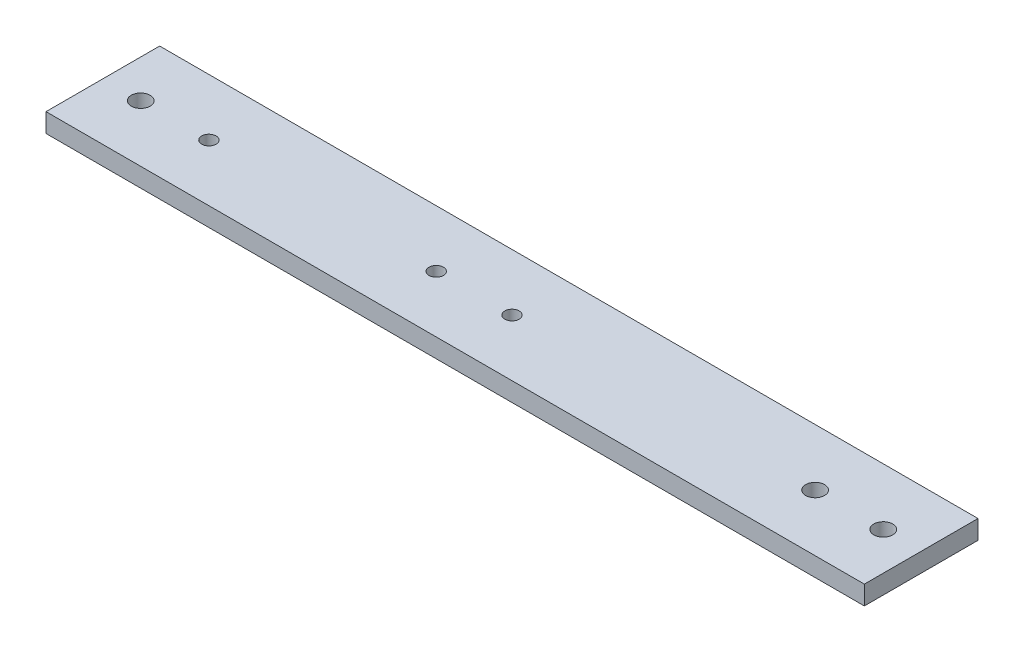
ISO-10303-21;
HEADER;
FILE_DESCRIPTION(('STEP AP214'),'2;1');
FILE_NAME('part.step','',(''),(''),'','','');
FILE_SCHEMA(('AUTOMOTIVE_DESIGN { 1 0 10303 214 1 1 1 1 }'));
ENDSEC;
DATA;
#1=APPLICATION_CONTEXT('core data for automotive mechanical design processes');
#2=APPLICATION_PROTOCOL_DEFINITION('international standard','automotive_design',2000,#1);
#3=PRODUCT_CONTEXT('',#1,'mechanical');
#4=PRODUCT('Part','Part','',(#3));
#5=PRODUCT_RELATED_PRODUCT_CATEGORY('part','',(#4));
#6=PRODUCT_DEFINITION_FORMATION('','',#4);
#7=PRODUCT_DEFINITION_CONTEXT('part definition',#1,'design');
#8=PRODUCT_DEFINITION('design','',#6,#7);
#9=PRODUCT_DEFINITION_SHAPE('','',#8);
#10=(LENGTH_UNIT() NAMED_UNIT(*) SI_UNIT(.MILLI.,.METRE.));
#11=(NAMED_UNIT(*) PLANE_ANGLE_UNIT() SI_UNIT($,.RADIAN.));
#12=(NAMED_UNIT(*) SI_UNIT($,.STERADIAN.) SOLID_ANGLE_UNIT());
#13=UNCERTAINTY_MEASURE_WITH_UNIT(LENGTH_MEASURE(1.E-05),#10,'distance_accuracy_value','');
#14=(GEOMETRIC_REPRESENTATION_CONTEXT(3) GLOBAL_UNCERTAINTY_ASSIGNED_CONTEXT((#13)) GLOBAL_UNIT_ASSIGNED_CONTEXT((#10,
#11,#12)) REPRESENTATION_CONTEXT('',''));
#15=CARTESIAN_POINT('',(0.,0.,0.));
#16=DIRECTION('',(0.,0.,1.));
#17=DIRECTION('',(1.,0.,0.));
#18=AXIS2_PLACEMENT_3D('',#15,#16,#17);
#19=CARTESIAN_POINT('',(0.,6.35,0.));
#20=DIRECTION('',(0.,-1.,0.));
#21=DIRECTION('',(0.,0.,-1.));
#22=AXIS2_PLACEMENT_3D('',#19,#20,#21);
#23=PLANE('',#22);
#24=DIRECTION('',(0.,0.,-1.));
#25=VECTOR('',#24,1.);
#26=CARTESIAN_POINT('',(137.16,6.35,19.05));
#27=LINE('',#26,#25);
#28=CARTESIAN_POINT('',(137.16,6.35,19.05));
#29=VERTEX_POINT('',#28);
#30=CARTESIAN_POINT('',(137.16,6.35,-19.05));
#31=VERTEX_POINT('',#30);
#32=EDGE_CURVE('E84',#29,#31,#27,.T.);
#33=ORIENTED_EDGE('',*,*,#32,.T.);
#34=DIRECTION('',(-1.,0.,0.));
#35=VECTOR('',#34,1.);
#36=CARTESIAN_POINT('',(-137.16,6.35,-19.05));
#37=LINE('',#36,#35);
#38=CARTESIAN_POINT('',(-137.16,6.35,-19.05));
#39=VERTEX_POINT('',#38);
#40=EDGE_CURVE('E79',#31,#39,#37,.T.);
#41=ORIENTED_EDGE('',*,*,#40,.T.);
#42=DIRECTION('',(0.,0.,1.));
#43=VECTOR('',#42,1.);
#44=CARTESIAN_POINT('',(-137.16,6.35,19.05));
#45=LINE('',#44,#43);
#46=CARTESIAN_POINT('',(-137.16,6.35,19.05));
#47=VERTEX_POINT('',#46);
#48=EDGE_CURVE('E82',#39,#47,#45,.T.);
#49=ORIENTED_EDGE('',*,*,#48,.T.);
#50=DIRECTION('',(1.,0.,0.));
#51=VECTOR('',#50,1.);
#52=CARTESIAN_POINT('',(-137.16,6.35,19.05));
#53=LINE('',#52,#51);
#54=EDGE_CURVE('E49',#47,#29,#53,.T.);
#55=ORIENTED_EDGE('',*,*,#54,.T.);
#56=EDGE_LOOP('',(#33,#41,#49,#55));
#57=FACE_BOUND('',#56,.T.);
#58=CARTESIAN_POINT('',(-124.46,6.35,0.));
#59=DIRECTION('',(0.,1.,0.));
#60=DIRECTION('',(0.,0.,1.));
#61=AXIS2_PLACEMENT_3D('',#58,#59,#60);
#62=CIRCLE('',#61,3.175);
#63=CARTESIAN_POINT('',(-124.46,6.35,3.175));
#64=VERTEX_POINT('',#63);
#65=EDGE_CURVE('E99',#64,#64,#62,.T.);
#66=ORIENTED_EDGE('',*,*,#65,.F.);
#67=EDGE_LOOP('',(#66));
#68=FACE_BOUND('',#67,.T.);
#69=CARTESIAN_POINT('',(124.46,6.35,0.));
#70=DIRECTION('',(0.,1.,0.));
#71=DIRECTION('',(0.,0.,1.));
#72=AXIS2_PLACEMENT_3D('',#69,#70,#71);
#73=CIRCLE('',#72,3.17499999999998);
#74=CARTESIAN_POINT('',(124.46,6.35,3.17499999999998));
#75=VERTEX_POINT('',#74);
#76=EDGE_CURVE('E114',#75,#75,#73,.T.);
#77=ORIENTED_EDGE('',*,*,#76,.F.);
#78=EDGE_LOOP('',(#77));
#79=FACE_BOUND('',#78,.T.);
#80=CARTESIAN_POINT('',(-101.6,6.35,0.));
#81=DIRECTION('',(0.,1.,0.));
#82=DIRECTION('',(0.,0.,1.));
#83=AXIS2_PLACEMENT_3D('',#80,#81,#82);
#84=CIRCLE('',#83,2.413);
#85=CARTESIAN_POINT('',(-101.6,6.35,2.413));
#86=VERTEX_POINT('',#85);
#87=EDGE_CURVE('E120',#86,#86,#84,.T.);
#88=ORIENTED_EDGE('',*,*,#87,.F.);
#89=EDGE_LOOP('',(#88));
#90=FACE_BOUND('',#89,.T.);
#91=CARTESIAN_POINT('',(-25.4,6.35,0.));
#92=DIRECTION('',(0.,1.,0.));
#93=DIRECTION('',(0.,0.,1.));
#94=AXIS2_PLACEMENT_3D('',#91,#92,#93);
#95=CIRCLE('',#94,2.413);
#96=CARTESIAN_POINT('',(-25.4,6.35,2.413));
#97=VERTEX_POINT('',#96);
#98=EDGE_CURVE('E126',#97,#97,#95,.T.);
#99=ORIENTED_EDGE('',*,*,#98,.F.);
#100=EDGE_LOOP('',(#99));
#101=FACE_BOUND('',#100,.T.);
#102=CARTESIAN_POINT('',(0.,6.35,0.));
#103=DIRECTION('',(0.,1.,0.));
#104=DIRECTION('',(0.,0.,1.));
#105=AXIS2_PLACEMENT_3D('',#102,#103,#104);
#106=CIRCLE('',#105,2.413);
#107=CARTESIAN_POINT('',(0.,6.35,2.413));
#108=VERTEX_POINT('',#107);
#109=EDGE_CURVE('E132',#108,#108,#106,.T.);
#110=ORIENTED_EDGE('',*,*,#109,.F.);
#111=EDGE_LOOP('',(#110));
#112=FACE_BOUND('',#111,.T.);
#113=CARTESIAN_POINT('',(101.6,6.35,0.));
#114=DIRECTION('',(0.,1.,0.));
#115=DIRECTION('',(0.,0.,1.));
#116=AXIS2_PLACEMENT_3D('',#113,#114,#115);
#117=CIRCLE('',#116,3.175);
#118=CARTESIAN_POINT('',(101.6,6.35,3.175));
#119=VERTEX_POINT('',#118);
#120=EDGE_CURVE('E138',#119,#119,#117,.T.);
#121=ORIENTED_EDGE('',*,*,#120,.F.);
#122=EDGE_LOOP('',(#121));
#123=FACE_BOUND('',#122,.T.);
#124=ADVANCED_FACE('F32',(#57,#68,#79,#90,#101,#112,#123),#23,.F.);
#125=CARTESIAN_POINT('',(0.,0.,0.));
#126=DIRECTION('',(0.,-1.,0.));
#127=DIRECTION('',(0.,0.,-1.));
#128=AXIS2_PLACEMENT_3D('',#125,#126,#127);
#129=PLANE('',#128);
#130=CARTESIAN_POINT('',(0.,0.,0.));
#131=DIRECTION('',(0.,1.,0.));
#132=DIRECTION('',(0.,0.,1.));
#133=AXIS2_PLACEMENT_3D('',#130,#131,#132);
#134=CIRCLE('',#133,2.413);
#135=CARTESIAN_POINT('',(0.,0.,2.413));
#136=VERTEX_POINT('',#135);
#137=EDGE_CURVE('E135',#136,#136,#134,.T.);
#138=ORIENTED_EDGE('',*,*,#137,.T.);
#139=EDGE_LOOP('',(#138));
#140=FACE_BOUND('',#139,.T.);
#141=CARTESIAN_POINT('',(-101.6,0.,0.));
#142=DIRECTION('',(0.,1.,0.));
#143=DIRECTION('',(0.,0.,1.));
#144=AXIS2_PLACEMENT_3D('',#141,#142,#143);
#145=CIRCLE('',#144,2.413);
#146=CARTESIAN_POINT('',(-101.6,0.,2.413));
#147=VERTEX_POINT('',#146);
#148=EDGE_CURVE('E123',#147,#147,#145,.T.);
#149=ORIENTED_EDGE('',*,*,#148,.T.);
#150=EDGE_LOOP('',(#149));
#151=FACE_BOUND('',#150,.T.);
#152=CARTESIAN_POINT('',(-124.46,0.,0.));
#153=DIRECTION('',(0.,1.,0.));
#154=DIRECTION('',(0.,0.,1.));
#155=AXIS2_PLACEMENT_3D('',#152,#153,#154);
#156=CIRCLE('',#155,3.175);
#157=CARTESIAN_POINT('',(-124.46,0.,3.175));
#158=VERTEX_POINT('',#157);
#159=EDGE_CURVE('E111',#158,#158,#156,.T.);
#160=ORIENTED_EDGE('',*,*,#159,.T.);
#161=EDGE_LOOP('',(#160));
#162=FACE_BOUND('',#161,.T.);
#163=DIRECTION('',(0.,0.,-1.));
#164=VECTOR('',#163,1.);
#165=CARTESIAN_POINT('',(137.16,0.,19.05));
#166=LINE('',#165,#164);
#167=CARTESIAN_POINT('',(137.16,0.,19.05));
#168=VERTEX_POINT('',#167);
#169=CARTESIAN_POINT('',(137.16,0.,-19.05));
#170=VERTEX_POINT('',#169);
#171=EDGE_CURVE('E96',#168,#170,#166,.T.);
#172=ORIENTED_EDGE('',*,*,#171,.F.);
#173=DIRECTION('',(1.,0.,0.));
#174=VECTOR('',#173,1.);
#175=CARTESIAN_POINT('',(-137.16,0.,19.05));
#176=LINE('',#175,#174);
#177=CARTESIAN_POINT('',(-137.16,0.,19.05));
#178=VERTEX_POINT('',#177);
#179=EDGE_CURVE('E72',#178,#168,#176,.T.);
#180=ORIENTED_EDGE('',*,*,#179,.F.);
#181=DIRECTION('',(0.,0.,1.));
#182=VECTOR('',#181,1.);
#183=CARTESIAN_POINT('',(-137.16,0.,19.05));
#184=LINE('',#183,#182);
#185=CARTESIAN_POINT('',(-137.16,0.,-19.05));
#186=VERTEX_POINT('',#185);
#187=EDGE_CURVE('E66',#186,#178,#184,.T.);
#188=ORIENTED_EDGE('',*,*,#187,.F.);
#189=DIRECTION('',(-1.,0.,0.));
#190=VECTOR('',#189,1.);
#191=CARTESIAN_POINT('',(-137.16,0.,-19.05));
#192=LINE('',#191,#190);
#193=EDGE_CURVE('E88',#170,#186,#192,.T.);
#194=ORIENTED_EDGE('',*,*,#193,.F.);
#195=EDGE_LOOP('',(#172,#180,#188,#194));
#196=FACE_BOUND('',#195,.T.);
#197=CARTESIAN_POINT('',(124.46,0.,0.));
#198=DIRECTION('',(0.,1.,0.));
#199=DIRECTION('',(0.,0.,1.));
#200=AXIS2_PLACEMENT_3D('',#197,#198,#199);
#201=CIRCLE('',#200,3.17499999999998);
#202=CARTESIAN_POINT('',(124.46,0.,3.17499999999998));
#203=VERTEX_POINT('',#202);
#204=EDGE_CURVE('E117',#203,#203,#201,.T.);
#205=ORIENTED_EDGE('',*,*,#204,.T.);
#206=EDGE_LOOP('',(#205));
#207=FACE_BOUND('',#206,.T.);
#208=CARTESIAN_POINT('',(-25.4,0.,0.));
#209=DIRECTION('',(0.,1.,0.));
#210=DIRECTION('',(0.,0.,1.));
#211=AXIS2_PLACEMENT_3D('',#208,#209,#210);
#212=CIRCLE('',#211,2.413);
#213=CARTESIAN_POINT('',(-25.4,0.,2.413));
#214=VERTEX_POINT('',#213);
#215=EDGE_CURVE('E129',#214,#214,#212,.T.);
#216=ORIENTED_EDGE('',*,*,#215,.T.);
#217=EDGE_LOOP('',(#216));
#218=FACE_BOUND('',#217,.T.);
#219=CARTESIAN_POINT('',(101.6,0.,0.));
#220=DIRECTION('',(0.,1.,0.));
#221=DIRECTION('',(0.,0.,1.));
#222=AXIS2_PLACEMENT_3D('',#219,#220,#221);
#223=CIRCLE('',#222,3.175);
#224=CARTESIAN_POINT('',(101.6,0.,3.175));
#225=VERTEX_POINT('',#224);
#226=EDGE_CURVE('E141',#225,#225,#223,.T.);
#227=ORIENTED_EDGE('',*,*,#226,.T.);
#228=EDGE_LOOP('',(#227));
#229=FACE_BOUND('',#228,.T.);
#230=ADVANCED_FACE('F107',(#140,#151,#162,#196,#207,#218,#229),#129,.T.);
#231=CARTESIAN_POINT('',(137.16,6.35,19.05));
#232=DIRECTION('',(-1.,0.,0.));
#233=DIRECTION('',(0.,0.,1.));
#234=AXIS2_PLACEMENT_3D('',#231,#232,#233);
#235=PLANE('',#234);
#236=ORIENTED_EDGE('',*,*,#171,.T.);
#237=DIRECTION('',(0.,-1.,0.));
#238=VECTOR('',#237,1.);
#239=CARTESIAN_POINT('',(137.16,6.35,-19.05));
#240=LINE('',#239,#238);
#241=EDGE_CURVE('E11',#31,#170,#240,.T.);
#242=ORIENTED_EDGE('',*,*,#241,.F.);
#243=ORIENTED_EDGE('',*,*,#32,.F.);
#244=DIRECTION('',(0.,-1.,0.));
#245=VECTOR('',#244,1.);
#246=CARTESIAN_POINT('',(137.16,6.35,19.05));
#247=LINE('',#246,#245);
#248=EDGE_CURVE('E92',#29,#168,#247,.T.);
#249=ORIENTED_EDGE('',*,*,#248,.T.);
#250=EDGE_LOOP('',(#236,#242,#243,#249));
#251=FACE_BOUND('',#250,.T.);
#252=ADVANCED_FACE('F34',(#251),#235,.F.);
#253=CARTESIAN_POINT('',(-137.16,6.35,-19.05));
#254=DIRECTION('',(0.,0.,1.));
#255=DIRECTION('',(1.,0.,0.));
#256=AXIS2_PLACEMENT_3D('',#253,#254,#255);
#257=PLANE('',#256);
#258=ORIENTED_EDGE('',*,*,#193,.T.);
#259=DIRECTION('',(0.,-1.,0.));
#260=VECTOR('',#259,1.);
#261=CARTESIAN_POINT('',(-137.16,6.35,-19.05));
#262=LINE('',#261,#260);
#263=EDGE_CURVE('E41',#39,#186,#262,.T.);
#264=ORIENTED_EDGE('',*,*,#263,.F.);
#265=ORIENTED_EDGE('',*,*,#40,.F.);
#266=ORIENTED_EDGE('',*,*,#241,.T.);
#267=EDGE_LOOP('',(#258,#264,#265,#266));
#268=FACE_BOUND('',#267,.T.);
#269=ADVANCED_FACE('F87',(#268),#257,.F.);
#270=CARTESIAN_POINT('',(-137.16,6.35,19.05));
#271=DIRECTION('',(1.,0.,0.));
#272=DIRECTION('',(0.,0.,-1.));
#273=AXIS2_PLACEMENT_3D('',#270,#271,#272);
#274=PLANE('',#273);
#275=ORIENTED_EDGE('',*,*,#187,.T.);
#276=DIRECTION('',(0.,-1.,0.));
#277=VECTOR('',#276,1.);
#278=CARTESIAN_POINT('',(-137.16,6.35,19.05));
#279=LINE('',#278,#277);
#280=EDGE_CURVE('E89',#47,#178,#279,.T.);
#281=ORIENTED_EDGE('',*,*,#280,.F.);
#282=ORIENTED_EDGE('',*,*,#48,.F.);
#283=ORIENTED_EDGE('',*,*,#263,.T.);
#284=EDGE_LOOP('',(#275,#281,#282,#283));
#285=FACE_BOUND('',#284,.T.);
#286=ADVANCED_FACE('F90',(#285),#274,.F.);
#287=CARTESIAN_POINT('',(-137.16,6.35,19.05));
#288=DIRECTION('',(0.,0.,-1.));
#289=DIRECTION('',(-1.,0.,0.));
#290=AXIS2_PLACEMENT_3D('',#287,#288,#289);
#291=PLANE('',#290);
#292=ORIENTED_EDGE('',*,*,#179,.T.);
#293=ORIENTED_EDGE('',*,*,#248,.F.);
#294=ORIENTED_EDGE('',*,*,#54,.F.);
#295=ORIENTED_EDGE('',*,*,#280,.T.);
#296=EDGE_LOOP('',(#292,#293,#294,#295));
#297=FACE_BOUND('',#296,.T.);
#298=ADVANCED_FACE('F104',(#297),#291,.F.);
#299=CARTESIAN_POINT('',(-124.46,6.35,0.));
#300=DIRECTION('',(0.,-1.,0.));
#301=DIRECTION('',(0.,0.,-1.));
#302=AXIS2_PLACEMENT_3D('',#299,#300,#301);
#303=CYLINDRICAL_SURFACE('',#302,3.175);
#304=ORIENTED_EDGE('',*,*,#65,.T.);
#305=EDGE_LOOP('',(#304));
#306=FACE_BOUND('',#305,.T.);
#307=ORIENTED_EDGE('',*,*,#159,.F.);
#308=EDGE_LOOP('',(#307));
#309=FACE_BOUND('',#308,.T.);
#310=ADVANCED_FACE('F158',(#306,#309),#303,.F.);
#311=CARTESIAN_POINT('',(124.46,6.35,0.));
#312=DIRECTION('',(0.,-1.,0.));
#313=DIRECTION('',(0.,0.,-1.));
#314=AXIS2_PLACEMENT_3D('',#311,#312,#313);
#315=CYLINDRICAL_SURFACE('',#314,3.17499999999998);
#316=ORIENTED_EDGE('',*,*,#76,.T.);
#317=EDGE_LOOP('',(#316));
#318=FACE_BOUND('',#317,.T.);
#319=ORIENTED_EDGE('',*,*,#204,.F.);
#320=EDGE_LOOP('',(#319));
#321=FACE_BOUND('',#320,.T.);
#322=ADVANCED_FACE('F204',(#318,#321),#315,.F.);
#323=CARTESIAN_POINT('',(-101.6,6.35,0.));
#324=DIRECTION('',(0.,-1.,0.));
#325=DIRECTION('',(0.,0.,-1.));
#326=AXIS2_PLACEMENT_3D('',#323,#324,#325);
#327=CYLINDRICAL_SURFACE('',#326,2.413);
#328=ORIENTED_EDGE('',*,*,#87,.T.);
#329=EDGE_LOOP('',(#328));
#330=FACE_BOUND('',#329,.T.);
#331=ORIENTED_EDGE('',*,*,#148,.F.);
#332=EDGE_LOOP('',(#331));
#333=FACE_BOUND('',#332,.T.);
#334=ADVANCED_FACE('F212',(#330,#333),#327,.F.);
#335=CARTESIAN_POINT('',(-25.4,6.35,0.));
#336=DIRECTION('',(0.,-1.,0.));
#337=DIRECTION('',(0.,0.,-1.));
#338=AXIS2_PLACEMENT_3D('',#335,#336,#337);
#339=CYLINDRICAL_SURFACE('',#338,2.413);
#340=ORIENTED_EDGE('',*,*,#98,.T.);
#341=EDGE_LOOP('',(#340));
#342=FACE_BOUND('',#341,.T.);
#343=ORIENTED_EDGE('',*,*,#215,.F.);
#344=EDGE_LOOP('',(#343));
#345=FACE_BOUND('',#344,.T.);
#346=ADVANCED_FACE('F220',(#342,#345),#339,.F.);
#347=CARTESIAN_POINT('',(0.,6.35,0.));
#348=DIRECTION('',(0.,-1.,0.));
#349=DIRECTION('',(0.,0.,-1.));
#350=AXIS2_PLACEMENT_3D('',#347,#348,#349);
#351=CYLINDRICAL_SURFACE('',#350,2.413);
#352=ORIENTED_EDGE('',*,*,#109,.T.);
#353=EDGE_LOOP('',(#352));
#354=FACE_BOUND('',#353,.T.);
#355=ORIENTED_EDGE('',*,*,#137,.F.);
#356=EDGE_LOOP('',(#355));
#357=FACE_BOUND('',#356,.T.);
#358=ADVANCED_FACE('F229',(#354,#357),#351,.F.);
#359=CARTESIAN_POINT('',(101.6,6.35,0.));
#360=DIRECTION('',(0.,-1.,0.));
#361=DIRECTION('',(0.,0.,-1.));
#362=AXIS2_PLACEMENT_3D('',#359,#360,#361);
#363=CYLINDRICAL_SURFACE('',#362,3.175);
#364=ORIENTED_EDGE('',*,*,#120,.T.);
#365=EDGE_LOOP('',(#364));
#366=FACE_BOUND('',#365,.T.);
#367=ORIENTED_EDGE('',*,*,#226,.F.);
#368=EDGE_LOOP('',(#367));
#369=FACE_BOUND('',#368,.T.);
#370=ADVANCED_FACE('F147',(#366,#369),#363,.F.);
#371=CLOSED_SHELL('',(#124,#230,#252,#269,#286,#298,#310,#322,#334,#346,#358,#370));
#372=MANIFOLD_SOLID_BREP('B2',#371);
#373=ADVANCED_BREP_SHAPE_REPRESENTATION('',(#18,#372),#14);
#374=SHAPE_DEFINITION_REPRESENTATION(#9,#373);
ENDSEC;
END-ISO-10303-21;
